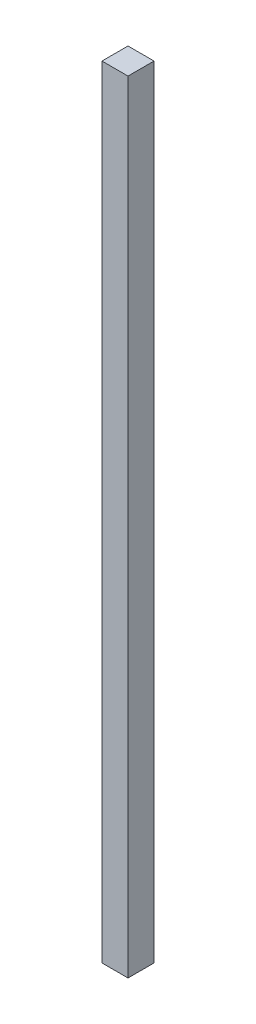
ISO-10303-21;
HEADER;
FILE_DESCRIPTION(('STEP AP214'),'2;1');
FILE_NAME('part.step','',(''),(''),'','','');
FILE_SCHEMA(('AUTOMOTIVE_DESIGN { 1 0 10303 214 1 1 1 1 }'));
ENDSEC;
DATA;
#1=APPLICATION_CONTEXT('core data for automotive mechanical design processes');
#2=APPLICATION_PROTOCOL_DEFINITION('international standard','automotive_design',2000,#1);
#3=PRODUCT_CONTEXT('',#1,'mechanical');
#4=PRODUCT('Part','Part','',(#3));
#5=PRODUCT_RELATED_PRODUCT_CATEGORY('part','',(#4));
#6=PRODUCT_DEFINITION_FORMATION('','',#4);
#7=PRODUCT_DEFINITION_CONTEXT('part definition',#1,'design');
#8=PRODUCT_DEFINITION('design','',#6,#7);
#9=PRODUCT_DEFINITION_SHAPE('','',#8);
#10=(LENGTH_UNIT() NAMED_UNIT(*) SI_UNIT(.MILLI.,.METRE.));
#11=(NAMED_UNIT(*) PLANE_ANGLE_UNIT() SI_UNIT($,.RADIAN.));
#12=(NAMED_UNIT(*) SI_UNIT($,.STERADIAN.) SOLID_ANGLE_UNIT());
#13=UNCERTAINTY_MEASURE_WITH_UNIT(LENGTH_MEASURE(1.E-05),#10,'distance_accuracy_value','');
#14=(GEOMETRIC_REPRESENTATION_CONTEXT(3) GLOBAL_UNCERTAINTY_ASSIGNED_CONTEXT((#13)) GLOBAL_UNIT_ASSIGNED_CONTEXT((#10,
#11,#12)) REPRESENTATION_CONTEXT('',''));
#15=CARTESIAN_POINT('',(0.,0.,0.));
#16=DIRECTION('',(0.,0.,1.));
#17=DIRECTION('',(1.,0.,0.));
#18=AXIS2_PLACEMENT_3D('',#15,#16,#17);
#19=CARTESIAN_POINT('',(2.5,150.,-2.5));
#20=DIRECTION('',(-1.,0.,0.));
#21=DIRECTION('',(0.,0.,1.));
#22=AXIS2_PLACEMENT_3D('',#19,#20,#21);
#23=PLANE('',#22);
#24=DIRECTION('',(0.,0.,-1.));
#25=VECTOR('',#24,1.);
#26=CARTESIAN_POINT('',(2.5,0.,-2.5));
#27=LINE('',#26,#25);
#28=CARTESIAN_POINT('',(2.5,0.,2.5));
#29=VERTEX_POINT('',#28);
#30=CARTESIAN_POINT('',(2.5,0.,-2.5));
#31=VERTEX_POINT('',#30);
#32=EDGE_CURVE('E107',#29,#31,#27,.T.);
#33=ORIENTED_EDGE('',*,*,#32,.T.);
#34=DIRECTION('',(0.,-1.,0.));
#35=VECTOR('',#34,1.);
#36=CARTESIAN_POINT('',(2.5,150.,-2.5));
#37=LINE('',#36,#35);
#38=CARTESIAN_POINT('',(2.5,150.,-2.5));
#39=VERTEX_POINT('',#38);
#40=EDGE_CURVE('E11',#39,#31,#37,.T.);
#41=ORIENTED_EDGE('',*,*,#40,.F.);
#42=DIRECTION('',(0.,0.,-1.));
#43=VECTOR('',#42,1.);
#44=CARTESIAN_POINT('',(2.5,150.,-2.5));
#45=LINE('',#44,#43);
#46=CARTESIAN_POINT('',(2.5,150.,2.5));
#47=VERTEX_POINT('',#46);
#48=EDGE_CURVE('E91',#47,#39,#45,.T.);
#49=ORIENTED_EDGE('',*,*,#48,.F.);
#50=DIRECTION('',(0.,-1.,0.));
#51=VECTOR('',#50,1.);
#52=CARTESIAN_POINT('',(2.5,150.,2.5));
#53=LINE('',#52,#51);
#54=EDGE_CURVE('E103',#47,#29,#53,.T.);
#55=ORIENTED_EDGE('',*,*,#54,.T.);
#56=EDGE_LOOP('',(#33,#41,#49,#55));
#57=FACE_BOUND('',#56,.T.);
#58=ADVANCED_FACE('F39',(#57),#23,.F.);
#59=CARTESIAN_POINT('',(-2.5,150.,-2.5));
#60=DIRECTION('',(0.,0.,1.));
#61=DIRECTION('',(1.,0.,0.));
#62=AXIS2_PLACEMENT_3D('',#59,#60,#61);
#63=PLANE('',#62);
#64=DIRECTION('',(-1.,0.,0.));
#65=VECTOR('',#64,1.);
#66=CARTESIAN_POINT('',(-2.5,0.,-2.5));
#67=LINE('',#66,#65);
#68=CARTESIAN_POINT('',(-2.5,0.,-2.5));
#69=VERTEX_POINT('',#68);
#70=EDGE_CURVE('E96',#31,#69,#67,.T.);
#71=ORIENTED_EDGE('',*,*,#70,.T.);
#72=DIRECTION('',(0.,-1.,0.));
#73=VECTOR('',#72,1.);
#74=CARTESIAN_POINT('',(-2.5,150.,-2.5));
#75=LINE('',#74,#73);
#76=CARTESIAN_POINT('',(-2.5,150.,-2.5));
#77=VERTEX_POINT('',#76);
#78=EDGE_CURVE('E48',#77,#69,#75,.T.);
#79=ORIENTED_EDGE('',*,*,#78,.F.);
#80=DIRECTION('',(-1.,0.,0.));
#81=VECTOR('',#80,1.);
#82=CARTESIAN_POINT('',(-2.5,150.,-2.5));
#83=LINE('',#82,#81);
#84=EDGE_CURVE('E86',#39,#77,#83,.T.);
#85=ORIENTED_EDGE('',*,*,#84,.F.);
#86=ORIENTED_EDGE('',*,*,#40,.T.);
#87=EDGE_LOOP('',(#71,#79,#85,#86));
#88=FACE_BOUND('',#87,.T.);
#89=ADVANCED_FACE('F95',(#88),#63,.F.);
#90=CARTESIAN_POINT('',(-2.5,150.,-2.5));
#91=DIRECTION('',(1.,0.,0.));
#92=DIRECTION('',(0.,0.,-1.));
#93=AXIS2_PLACEMENT_3D('',#90,#91,#92);
#94=PLANE('',#93);
#95=DIRECTION('',(0.,0.,1.));
#96=VECTOR('',#95,1.);
#97=CARTESIAN_POINT('',(-2.5,0.,-2.5));
#98=LINE('',#97,#96);
#99=CARTESIAN_POINT('',(-2.5,0.,2.5));
#100=VERTEX_POINT('',#99);
#101=EDGE_CURVE('E73',#69,#100,#98,.T.);
#102=ORIENTED_EDGE('',*,*,#101,.T.);
#103=DIRECTION('',(0.,-1.,0.));
#104=VECTOR('',#103,1.);
#105=CARTESIAN_POINT('',(-2.5,150.,2.5));
#106=LINE('',#105,#104);
#107=CARTESIAN_POINT('',(-2.5,150.,2.5));
#108=VERTEX_POINT('',#107);
#109=EDGE_CURVE('E98',#108,#100,#106,.T.);
#110=ORIENTED_EDGE('',*,*,#109,.F.);
#111=DIRECTION('',(0.,0.,1.));
#112=VECTOR('',#111,1.);
#113=CARTESIAN_POINT('',(-2.5,150.,-2.5));
#114=LINE('',#113,#112);
#115=EDGE_CURVE('E89',#77,#108,#114,.T.);
#116=ORIENTED_EDGE('',*,*,#115,.F.);
#117=ORIENTED_EDGE('',*,*,#78,.T.);
#118=EDGE_LOOP('',(#102,#110,#116,#117));
#119=FACE_BOUND('',#118,.T.);
#120=ADVANCED_FACE('F99',(#119),#94,.F.);
#121=CARTESIAN_POINT('',(-2.5,150.,2.5));
#122=DIRECTION('',(0.,0.,-1.));
#123=DIRECTION('',(-1.,0.,0.));
#124=AXIS2_PLACEMENT_3D('',#121,#122,#123);
#125=PLANE('',#124);
#126=DIRECTION('',(1.,0.,0.));
#127=VECTOR('',#126,1.);
#128=CARTESIAN_POINT('',(-2.5,0.,2.5));
#129=LINE('',#128,#127);
#130=EDGE_CURVE('E79',#100,#29,#129,.T.);
#131=ORIENTED_EDGE('',*,*,#130,.T.);
#132=ORIENTED_EDGE('',*,*,#54,.F.);
#133=DIRECTION('',(1.,0.,0.));
#134=VECTOR('',#133,1.);
#135=CARTESIAN_POINT('',(-2.5,150.,2.5));
#136=LINE('',#135,#134);
#137=EDGE_CURVE('E56',#108,#47,#136,.T.);
#138=ORIENTED_EDGE('',*,*,#137,.F.);
#139=ORIENTED_EDGE('',*,*,#109,.T.);
#140=EDGE_LOOP('',(#131,#132,#138,#139));
#141=FACE_BOUND('',#140,.T.);
#142=ADVANCED_FACE('F120',(#141),#125,.F.);
#143=CARTESIAN_POINT('',(0.,150.,0.));
#144=DIRECTION('',(0.,1.,0.));
#145=DIRECTION('',(0.,0.,1.));
#146=AXIS2_PLACEMENT_3D('',#143,#144,#145);
#147=PLANE('',#146);
#148=ORIENTED_EDGE('',*,*,#48,.T.);
#149=ORIENTED_EDGE('',*,*,#84,.T.);
#150=ORIENTED_EDGE('',*,*,#115,.T.);
#151=ORIENTED_EDGE('',*,*,#137,.T.);
#152=EDGE_LOOP('',(#148,#149,#150,#151));
#153=FACE_BOUND('',#152,.T.);
#154=ADVANCED_FACE('F87',(#153),#147,.T.);
#155=CARTESIAN_POINT('',(0.,0.,0.));
#156=DIRECTION('',(0.,1.,0.));
#157=DIRECTION('',(0.,0.,1.));
#158=AXIS2_PLACEMENT_3D('',#155,#156,#157);
#159=PLANE('',#158);
#160=ORIENTED_EDGE('',*,*,#32,.F.);
#161=ORIENTED_EDGE('',*,*,#130,.F.);
#162=ORIENTED_EDGE('',*,*,#101,.F.);
#163=ORIENTED_EDGE('',*,*,#70,.F.);
#164=EDGE_LOOP('',(#160,#161,#162,#163));
#165=FACE_BOUND('',#164,.T.);
#166=ADVANCED_FACE('F123',(#165),#159,.F.);
#167=CLOSED_SHELL('',(#58,#89,#120,#142,#154,#166));
#168=MANIFOLD_SOLID_BREP('B2',#167);
#169=ADVANCED_BREP_SHAPE_REPRESENTATION('',(#18,#168),#14);
#170=SHAPE_DEFINITION_REPRESENTATION(#9,#169);
ENDSEC;
END-ISO-10303-21;
